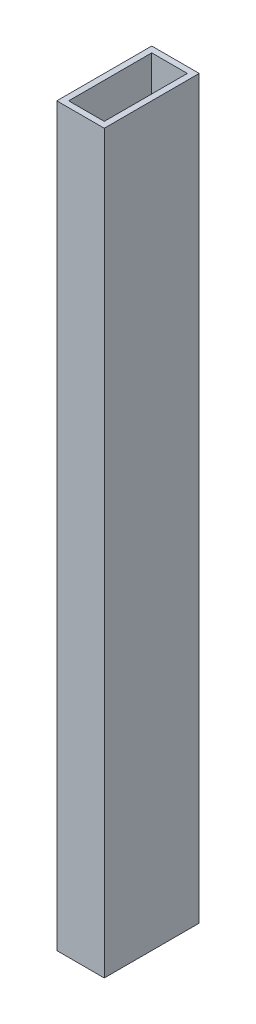
ISO-10303-21;
HEADER;
FILE_DESCRIPTION(('STEP AP214'),'2;1');
FILE_NAME('part.step','',(''),(''),'','','');
FILE_SCHEMA(('AUTOMOTIVE_DESIGN { 1 0 10303 214 1 1 1 1 }'));
ENDSEC;
DATA;
#1=APPLICATION_CONTEXT('core data for automotive mechanical design processes');
#2=APPLICATION_PROTOCOL_DEFINITION('international standard','automotive_design',2000,#1);
#3=PRODUCT_CONTEXT('',#1,'mechanical');
#4=PRODUCT('Part','Part','',(#3));
#5=PRODUCT_RELATED_PRODUCT_CATEGORY('part','',(#4));
#6=PRODUCT_DEFINITION_FORMATION('','',#4);
#7=PRODUCT_DEFINITION_CONTEXT('part definition',#1,'design');
#8=PRODUCT_DEFINITION('design','',#6,#7);
#9=PRODUCT_DEFINITION_SHAPE('','',#8);
#10=(LENGTH_UNIT() NAMED_UNIT(*) SI_UNIT(.MILLI.,.METRE.));
#11=(NAMED_UNIT(*) PLANE_ANGLE_UNIT() SI_UNIT($,.RADIAN.));
#12=(NAMED_UNIT(*) SI_UNIT($,.STERADIAN.) SOLID_ANGLE_UNIT());
#13=UNCERTAINTY_MEASURE_WITH_UNIT(LENGTH_MEASURE(1.E-05),#10,'distance_accuracy_value','');
#14=(GEOMETRIC_REPRESENTATION_CONTEXT(3) GLOBAL_UNCERTAINTY_ASSIGNED_CONTEXT((#13)) GLOBAL_UNIT_ASSIGNED_CONTEXT((#10,
#11,#12)) REPRESENTATION_CONTEXT('',''));
#15=CARTESIAN_POINT('',(0.,0.,0.));
#16=DIRECTION('',(0.,0.,1.));
#17=DIRECTION('',(1.,0.,0.));
#18=AXIS2_PLACEMENT_3D('',#15,#16,#17);
#19=CARTESIAN_POINT('',(0.,393.7,0.));
#20=DIRECTION('',(0.,-1.,0.));
#21=DIRECTION('',(0.,0.,-1.));
#22=AXIS2_PLACEMENT_3D('',#19,#20,#21);
#23=PLANE('',#22);
#24=DIRECTION('',(0.,0.,-1.));
#25=VECTOR('',#24,1.);
#26=CARTESIAN_POINT('',(12.7,393.7,25.4));
#27=LINE('',#26,#25);
#28=CARTESIAN_POINT('',(12.7,393.7,25.4));
#29=VERTEX_POINT('',#28);
#30=CARTESIAN_POINT('',(12.7,393.7,-25.4));
#31=VERTEX_POINT('',#30);
#32=EDGE_CURVE('E159',#29,#31,#27,.T.);
#33=ORIENTED_EDGE('',*,*,#32,.T.);
#34=DIRECTION('',(-1.,0.,0.));
#35=VECTOR('',#34,1.);
#36=CARTESIAN_POINT('',(-12.7,393.7,-25.4));
#37=LINE('',#36,#35);
#38=CARTESIAN_POINT('',(-12.7,393.7,-25.4));
#39=VERTEX_POINT('',#38);
#40=EDGE_CURVE('E163',#31,#39,#37,.T.);
#41=ORIENTED_EDGE('',*,*,#40,.T.);
#42=DIRECTION('',(0.,0.,1.));
#43=VECTOR('',#42,1.);
#44=CARTESIAN_POINT('',(-12.7,393.7,25.4));
#45=LINE('',#44,#43);
#46=CARTESIAN_POINT('',(-12.7,393.7,25.4));
#47=VERTEX_POINT('',#46);
#48=EDGE_CURVE('E167',#39,#47,#45,.T.);
#49=ORIENTED_EDGE('',*,*,#48,.T.);
#50=DIRECTION('',(1.,0.,0.));
#51=VECTOR('',#50,1.);
#52=CARTESIAN_POINT('',(-12.7,393.7,25.4));
#53=LINE('',#52,#51);
#54=EDGE_CURVE('E170',#47,#29,#53,.T.);
#55=ORIENTED_EDGE('',*,*,#54,.T.);
#56=EDGE_LOOP('',(#33,#41,#49,#55));
#57=FACE_BOUND('',#56,.T.);
#58=DIRECTION('',(0.,0.,1.));
#59=VECTOR('',#58,1.);
#60=CARTESIAN_POINT('',(-9.525,393.7,22.225));
#61=LINE('',#60,#59);
#62=CARTESIAN_POINT('',(-9.525,393.7,-22.225));
#63=VERTEX_POINT('',#62);
#64=CARTESIAN_POINT('',(-9.525,393.7,22.225));
#65=VERTEX_POINT('',#64);
#66=EDGE_CURVE('E111',#63,#65,#61,.T.);
#67=ORIENTED_EDGE('',*,*,#66,.F.);
#68=DIRECTION('',(-1.,0.,0.));
#69=VECTOR('',#68,1.);
#70=CARTESIAN_POINT('',(-9.525,393.7,-22.225));
#71=LINE('',#70,#69);
#72=CARTESIAN_POINT('',(9.525,393.7,-22.225));
#73=VERTEX_POINT('',#72);
#74=EDGE_CURVE('E137',#73,#63,#71,.T.);
#75=ORIENTED_EDGE('',*,*,#74,.F.);
#76=DIRECTION('',(0.,0.,-1.));
#77=VECTOR('',#76,1.);
#78=CARTESIAN_POINT('',(9.525,393.7,22.225));
#79=LINE('',#78,#77);
#80=CARTESIAN_POINT('',(9.525,393.7,22.225));
#81=VERTEX_POINT('',#80);
#82=EDGE_CURVE('E133',#81,#73,#79,.T.);
#83=ORIENTED_EDGE('',*,*,#82,.F.);
#84=DIRECTION('',(1.,0.,0.));
#85=VECTOR('',#84,1.);
#86=CARTESIAN_POINT('',(-9.525,393.7,22.225));
#87=LINE('',#86,#85);
#88=EDGE_CURVE('E120',#65,#81,#87,.T.);
#89=ORIENTED_EDGE('',*,*,#88,.F.);
#90=EDGE_LOOP('',(#67,#75,#83,#89));
#91=FACE_BOUND('',#90,.T.);
#92=ADVANCED_FACE('F45',(#57,#91),#23,.F.);
#93=CARTESIAN_POINT('',(0.,0.,0.));
#94=DIRECTION('',(0.,-1.,0.));
#95=DIRECTION('',(0.,0.,-1.));
#96=AXIS2_PLACEMENT_3D('',#93,#94,#95);
#97=PLANE('',#96);
#98=DIRECTION('',(0.,0.,-1.));
#99=VECTOR('',#98,1.);
#100=CARTESIAN_POINT('',(12.7,0.,25.4));
#101=LINE('',#100,#99);
#102=CARTESIAN_POINT('',(12.7,0.,25.4));
#103=VERTEX_POINT('',#102);
#104=CARTESIAN_POINT('',(12.7,0.,-25.4));
#105=VERTEX_POINT('',#104);
#106=EDGE_CURVE('E129',#103,#105,#101,.T.);
#107=ORIENTED_EDGE('',*,*,#106,.F.);
#108=DIRECTION('',(1.,0.,0.));
#109=VECTOR('',#108,1.);
#110=CARTESIAN_POINT('',(-12.7,0.,25.4));
#111=LINE('',#110,#109);
#112=CARTESIAN_POINT('',(-12.7,0.,25.4));
#113=VERTEX_POINT('',#112);
#114=EDGE_CURVE('E164',#113,#103,#111,.T.);
#115=ORIENTED_EDGE('',*,*,#114,.F.);
#116=DIRECTION('',(0.,0.,1.));
#117=VECTOR('',#116,1.);
#118=CARTESIAN_POINT('',(-12.7,0.,25.4));
#119=LINE('',#118,#117);
#120=CARTESIAN_POINT('',(-12.7,0.,-25.4));
#121=VERTEX_POINT('',#120);
#122=EDGE_CURVE('E180',#121,#113,#119,.T.);
#123=ORIENTED_EDGE('',*,*,#122,.F.);
#124=DIRECTION('',(-1.,0.,0.));
#125=VECTOR('',#124,1.);
#126=CARTESIAN_POINT('',(-12.7,0.,-25.4));
#127=LINE('',#126,#125);
#128=EDGE_CURVE('E177',#105,#121,#127,.T.);
#129=ORIENTED_EDGE('',*,*,#128,.F.);
#130=EDGE_LOOP('',(#107,#115,#123,#129));
#131=FACE_BOUND('',#130,.T.);
#132=DIRECTION('',(-1.,0.,0.));
#133=VECTOR('',#132,1.);
#134=CARTESIAN_POINT('',(-9.525,0.,-22.225));
#135=LINE('',#134,#133);
#136=CARTESIAN_POINT('',(9.525,0.,-22.225));
#137=VERTEX_POINT('',#136);
#138=CARTESIAN_POINT('',(-9.525,0.,-22.225));
#139=VERTEX_POINT('',#138);
#140=EDGE_CURVE('E121',#137,#139,#135,.T.);
#141=ORIENTED_EDGE('',*,*,#140,.T.);
#142=DIRECTION('',(0.,0.,1.));
#143=VECTOR('',#142,1.);
#144=CARTESIAN_POINT('',(-9.525,0.,22.225));
#145=LINE('',#144,#143);
#146=CARTESIAN_POINT('',(-9.525,0.,22.225));
#147=VERTEX_POINT('',#146);
#148=EDGE_CURVE('E69',#139,#147,#145,.T.);
#149=ORIENTED_EDGE('',*,*,#148,.T.);
#150=DIRECTION('',(1.,0.,0.));
#151=VECTOR('',#150,1.);
#152=CARTESIAN_POINT('',(-9.525,0.,22.225));
#153=LINE('',#152,#151);
#154=CARTESIAN_POINT('',(9.525,0.,22.225));
#155=VERTEX_POINT('',#154);
#156=EDGE_CURVE('E127',#147,#155,#153,.T.);
#157=ORIENTED_EDGE('',*,*,#156,.T.);
#158=DIRECTION('',(0.,0.,-1.));
#159=VECTOR('',#158,1.);
#160=CARTESIAN_POINT('',(9.525,0.,22.225));
#161=LINE('',#160,#159);
#162=EDGE_CURVE('E146',#155,#137,#161,.T.);
#163=ORIENTED_EDGE('',*,*,#162,.T.);
#164=EDGE_LOOP('',(#141,#149,#157,#163));
#165=FACE_BOUND('',#164,.T.);
#166=ADVANCED_FACE('F203',(#131,#165),#97,.T.);
#167=CARTESIAN_POINT('',(12.7,393.7,25.4));
#168=DIRECTION('',(-1.,0.,0.));
#169=DIRECTION('',(0.,0.,1.));
#170=AXIS2_PLACEMENT_3D('',#167,#168,#169);
#171=PLANE('',#170);
#172=ORIENTED_EDGE('',*,*,#106,.T.);
#173=DIRECTION('',(0.,-1.,0.));
#174=VECTOR('',#173,1.);
#175=CARTESIAN_POINT('',(12.7,393.7,-25.4));
#176=LINE('',#175,#174);
#177=EDGE_CURVE('E11',#31,#105,#176,.T.);
#178=ORIENTED_EDGE('',*,*,#177,.F.);
#179=ORIENTED_EDGE('',*,*,#32,.F.);
#180=DIRECTION('',(0.,-1.,0.));
#181=VECTOR('',#180,1.);
#182=CARTESIAN_POINT('',(12.7,393.7,25.4));
#183=LINE('',#182,#181);
#184=EDGE_CURVE('E173',#29,#103,#183,.T.);
#185=ORIENTED_EDGE('',*,*,#184,.T.);
#186=EDGE_LOOP('',(#172,#178,#179,#185));
#187=FACE_BOUND('',#186,.T.);
#188=ADVANCED_FACE('F47',(#187),#171,.F.);
#189=CARTESIAN_POINT('',(-12.7,393.7,-25.4));
#190=DIRECTION('',(0.,0.,1.));
#191=DIRECTION('',(1.,0.,0.));
#192=AXIS2_PLACEMENT_3D('',#189,#190,#191);
#193=PLANE('',#192);
#194=ORIENTED_EDGE('',*,*,#128,.T.);
#195=DIRECTION('',(0.,-1.,0.));
#196=VECTOR('',#195,1.);
#197=CARTESIAN_POINT('',(-12.7,393.7,-25.4));
#198=LINE('',#197,#196);
#199=EDGE_CURVE('E54',#39,#121,#198,.T.);
#200=ORIENTED_EDGE('',*,*,#199,.F.);
#201=ORIENTED_EDGE('',*,*,#40,.F.);
#202=ORIENTED_EDGE('',*,*,#177,.T.);
#203=EDGE_LOOP('',(#194,#200,#201,#202));
#204=FACE_BOUND('',#203,.T.);
#205=ADVANCED_FACE('F213',(#204),#193,.F.);
#206=CARTESIAN_POINT('',(-12.7,393.7,25.4));
#207=DIRECTION('',(1.,0.,0.));
#208=DIRECTION('',(0.,0.,-1.));
#209=AXIS2_PLACEMENT_3D('',#206,#207,#208);
#210=PLANE('',#209);
#211=ORIENTED_EDGE('',*,*,#122,.T.);
#212=DIRECTION('',(0.,-1.,0.));
#213=VECTOR('',#212,1.);
#214=CARTESIAN_POINT('',(-12.7,393.7,25.4));
#215=LINE('',#214,#213);
#216=EDGE_CURVE('E188',#47,#113,#215,.T.);
#217=ORIENTED_EDGE('',*,*,#216,.F.);
#218=ORIENTED_EDGE('',*,*,#48,.F.);
#219=ORIENTED_EDGE('',*,*,#199,.T.);
#220=EDGE_LOOP('',(#211,#217,#218,#219));
#221=FACE_BOUND('',#220,.T.);
#222=ADVANCED_FACE('F197',(#221),#210,.F.);
#223=CARTESIAN_POINT('',(-12.7,393.7,25.4));
#224=DIRECTION('',(0.,0.,-1.));
#225=DIRECTION('',(-1.,0.,0.));
#226=AXIS2_PLACEMENT_3D('',#223,#224,#225);
#227=PLANE('',#226);
#228=ORIENTED_EDGE('',*,*,#114,.T.);
#229=ORIENTED_EDGE('',*,*,#184,.F.);
#230=ORIENTED_EDGE('',*,*,#54,.F.);
#231=ORIENTED_EDGE('',*,*,#216,.T.);
#232=EDGE_LOOP('',(#228,#229,#230,#231));
#233=FACE_BOUND('',#232,.T.);
#234=ADVANCED_FACE('F207',(#233),#227,.F.);
#235=CARTESIAN_POINT('',(-9.525,393.7,22.225));
#236=DIRECTION('',(1.,0.,0.));
#237=DIRECTION('',(0.,0.,-1.));
#238=AXIS2_PLACEMENT_3D('',#235,#236,#237);
#239=PLANE('',#238);
#240=ORIENTED_EDGE('',*,*,#148,.F.);
#241=DIRECTION('',(0.,-1.,0.));
#242=VECTOR('',#241,1.);
#243=CARTESIAN_POINT('',(-9.525,393.7,-22.225));
#244=LINE('',#243,#242);
#245=EDGE_CURVE('E115',#63,#139,#244,.T.);
#246=ORIENTED_EDGE('',*,*,#245,.F.);
#247=ORIENTED_EDGE('',*,*,#66,.T.);
#248=DIRECTION('',(0.,-1.,0.));
#249=VECTOR('',#248,1.);
#250=CARTESIAN_POINT('',(-9.525,393.7,22.225));
#251=LINE('',#250,#249);
#252=EDGE_CURVE('E114',#65,#147,#251,.T.);
#253=ORIENTED_EDGE('',*,*,#252,.T.);
#254=EDGE_LOOP('',(#240,#246,#247,#253));
#255=FACE_BOUND('',#254,.T.);
#256=ADVANCED_FACE('F113',(#255),#239,.T.);
#257=CARTESIAN_POINT('',(-9.525,393.7,22.225));
#258=DIRECTION('',(0.,0.,-1.));
#259=DIRECTION('',(-1.,0.,0.));
#260=AXIS2_PLACEMENT_3D('',#257,#258,#259);
#261=PLANE('',#260);
#262=ORIENTED_EDGE('',*,*,#156,.F.);
#263=ORIENTED_EDGE('',*,*,#252,.F.);
#264=ORIENTED_EDGE('',*,*,#88,.T.);
#265=DIRECTION('',(0.,-1.,0.));
#266=VECTOR('',#265,1.);
#267=CARTESIAN_POINT('',(9.525,393.7,22.225));
#268=LINE('',#267,#266);
#269=EDGE_CURVE('E130',#81,#155,#268,.T.);
#270=ORIENTED_EDGE('',*,*,#269,.T.);
#271=EDGE_LOOP('',(#262,#263,#264,#270));
#272=FACE_BOUND('',#271,.T.);
#273=ADVANCED_FACE('F124',(#272),#261,.T.);
#274=CARTESIAN_POINT('',(9.525,393.7,22.225));
#275=DIRECTION('',(-1.,0.,0.));
#276=DIRECTION('',(0.,0.,1.));
#277=AXIS2_PLACEMENT_3D('',#274,#275,#276);
#278=PLANE('',#277);
#279=ORIENTED_EDGE('',*,*,#162,.F.);
#280=ORIENTED_EDGE('',*,*,#269,.F.);
#281=ORIENTED_EDGE('',*,*,#82,.T.);
#282=DIRECTION('',(0.,-1.,0.));
#283=VECTOR('',#282,1.);
#284=CARTESIAN_POINT('',(9.525,393.7,-22.225));
#285=LINE('',#284,#283);
#286=EDGE_CURVE('E61',#73,#137,#285,.T.);
#287=ORIENTED_EDGE('',*,*,#286,.T.);
#288=EDGE_LOOP('',(#279,#280,#281,#287));
#289=FACE_BOUND('',#288,.T.);
#290=ADVANCED_FACE('F236',(#289),#278,.T.);
#291=CARTESIAN_POINT('',(-9.525,393.7,-22.225));
#292=DIRECTION('',(0.,0.,1.));
#293=DIRECTION('',(1.,0.,0.));
#294=AXIS2_PLACEMENT_3D('',#291,#292,#293);
#295=PLANE('',#294);
#296=ORIENTED_EDGE('',*,*,#140,.F.);
#297=ORIENTED_EDGE('',*,*,#286,.F.);
#298=ORIENTED_EDGE('',*,*,#74,.T.);
#299=ORIENTED_EDGE('',*,*,#245,.T.);
#300=EDGE_LOOP('',(#296,#297,#298,#299));
#301=FACE_BOUND('',#300,.T.);
#302=ADVANCED_FACE('F240',(#301),#295,.T.);
#303=CLOSED_SHELL('',(#92,#166,#188,#205,#222,#234,#256,#273,#290,#302));
#304=MANIFOLD_SOLID_BREP('B2',#303);
#305=ADVANCED_BREP_SHAPE_REPRESENTATION('',(#18,#304),#14);
#306=SHAPE_DEFINITION_REPRESENTATION(#9,#305);
ENDSEC;
END-ISO-10303-21;
